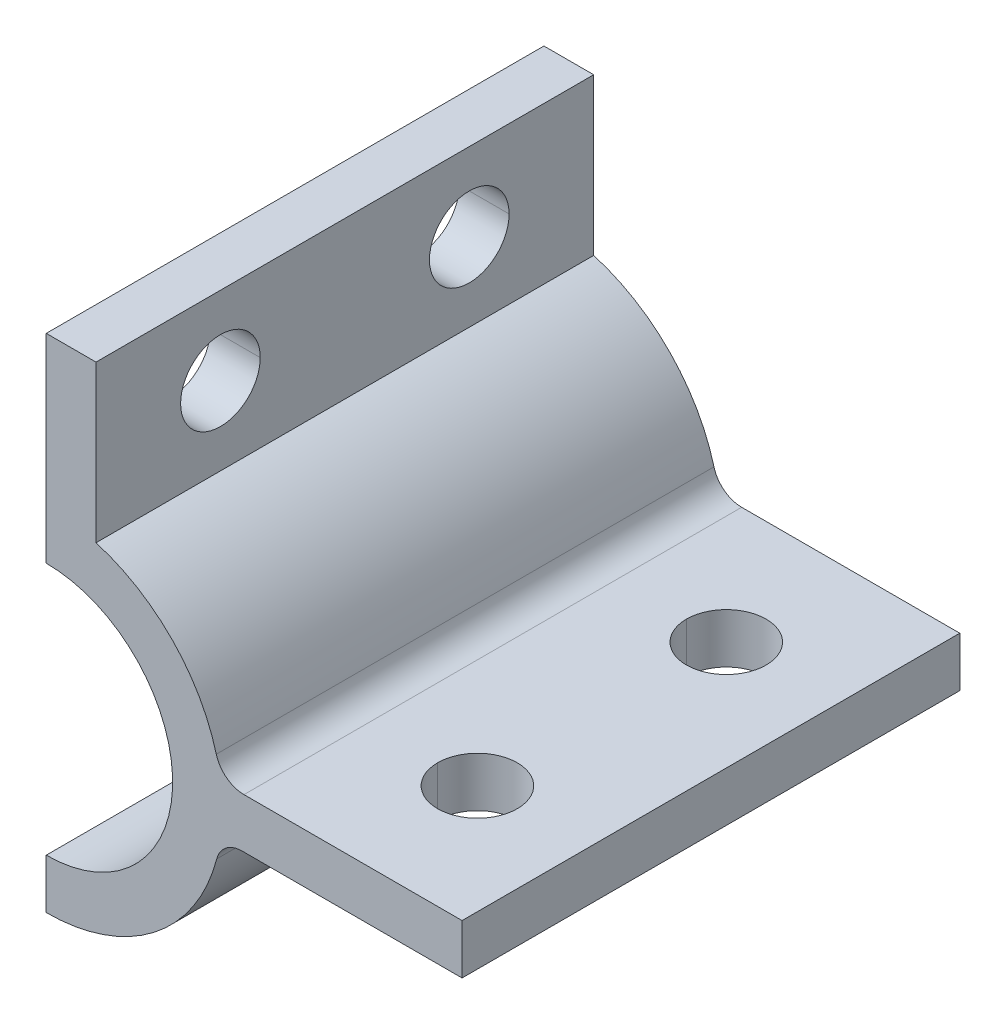
ISO-10303-21;
HEADER;
FILE_DESCRIPTION(('STEP AP214'),'2;1');
FILE_NAME('part.step','',(''),(''),'','','');
FILE_SCHEMA(('AUTOMOTIVE_DESIGN { 1 0 10303 214 1 1 1 1 }'));
ENDSEC;
DATA;
#1=APPLICATION_CONTEXT('core data for automotive mechanical design processes');
#2=APPLICATION_PROTOCOL_DEFINITION('international standard','automotive_design',2000,#1);
#3=PRODUCT_CONTEXT('',#1,'mechanical');
#4=PRODUCT('Part','Part','',(#3));
#5=PRODUCT_RELATED_PRODUCT_CATEGORY('part','',(#4));
#6=PRODUCT_DEFINITION_FORMATION('','',#4);
#7=PRODUCT_DEFINITION_CONTEXT('part definition',#1,'design');
#8=PRODUCT_DEFINITION('design','',#6,#7);
#9=PRODUCT_DEFINITION_SHAPE('','',#8);
#10=(LENGTH_UNIT() NAMED_UNIT(*) SI_UNIT(.MILLI.,.METRE.));
#11=(NAMED_UNIT(*) PLANE_ANGLE_UNIT() SI_UNIT($,.RADIAN.));
#12=(NAMED_UNIT(*) SI_UNIT($,.STERADIAN.) SOLID_ANGLE_UNIT());
#13=UNCERTAINTY_MEASURE_WITH_UNIT(LENGTH_MEASURE(1.E-05),#10,'distance_accuracy_value','');
#14=(GEOMETRIC_REPRESENTATION_CONTEXT(3) GLOBAL_UNCERTAINTY_ASSIGNED_CONTEXT((#13)) GLOBAL_UNIT_ASSIGNED_CONTEXT((#10,
#11,#12)) REPRESENTATION_CONTEXT('',''));
#15=CARTESIAN_POINT('',(0.,0.,0.));
#16=DIRECTION('',(0.,0.,1.));
#17=DIRECTION('',(1.,0.,0.));
#18=AXIS2_PLACEMENT_3D('',#15,#16,#17);
#19=CARTESIAN_POINT('',(5.,24.8395524028066,12.5));
#20=DIRECTION('',(1.,0.,0.));
#21=DIRECTION('',(0.,0.,-1.));
#22=AXIS2_PLACEMENT_3D('',#19,#20,#21);
#23=CYLINDRICAL_SURFACE('',#22,4.);
#24=DIRECTION('',(-1.,0.,0.));
#25=VECTOR('',#24,1.);
#26=CARTESIAN_POINT('',(5.,24.8395524028066,8.5));
#27=LINE('',#26,#25);
#28=CARTESIAN_POINT('',(5.,24.8395524028066,8.5));
#29=VERTEX_POINT('',#28);
#30=CARTESIAN_POINT('',(0.,24.8395524028066,8.5));
#31=VERTEX_POINT('',#30);
#32=EDGE_CURVE('E24',#29,#31,#27,.T.);
#33=ORIENTED_EDGE('',*,*,#32,.T.);
#34=CARTESIAN_POINT('',(0.,24.8395524028066,12.5));
#35=DIRECTION('',(1.,0.,0.));
#36=DIRECTION('',(0.,0.,1.));
#37=AXIS2_PLACEMENT_3D('',#34,#35,#36);
#38=CIRCLE('',#37,4.);
#39=CARTESIAN_POINT('',(0.,24.8395524028066,16.5));
#40=VERTEX_POINT('',#39);
#41=EDGE_CURVE('E31',#40,#31,#38,.T.);
#42=ORIENTED_EDGE('',*,*,#41,.F.);
#43=DIRECTION('',(-1.,0.,0.));
#44=VECTOR('',#43,1.);
#45=CARTESIAN_POINT('',(5.,24.8395524028066,16.5));
#46=LINE('',#45,#44);
#47=CARTESIAN_POINT('',(5.,24.8395524028066,16.5));
#48=VERTEX_POINT('',#47);
#49=EDGE_CURVE('E11',#48,#40,#46,.T.);
#50=ORIENTED_EDGE('',*,*,#49,.F.);
#51=CARTESIAN_POINT('',(5.,24.8395524028066,12.5));
#52=DIRECTION('',(1.,0.,0.));
#53=DIRECTION('',(0.,0.,1.));
#54=AXIS2_PLACEMENT_3D('',#51,#52,#53);
#55=CIRCLE('',#54,4.);
#56=EDGE_CURVE('E231',#48,#29,#55,.T.);
#57=ORIENTED_EDGE('',*,*,#56,.T.);
#58=EDGE_LOOP('',(#33,#42,#50,#57));
#59=FACE_BOUND('',#58,.T.);
#60=ADVANCED_FACE('F17',(#59),#23,.F.);
#61=CARTESIAN_POINT('',(5.,24.8395524028066,12.5));
#62=DIRECTION('',(1.,0.,0.));
#63=DIRECTION('',(0.,0.,-1.));
#64=AXIS2_PLACEMENT_3D('',#61,#62,#63);
#65=CYLINDRICAL_SURFACE('',#64,4.);
#66=ORIENTED_EDGE('',*,*,#49,.T.);
#67=CARTESIAN_POINT('',(0.,24.8395524028066,12.5));
#68=DIRECTION('',(1.,0.,0.));
#69=DIRECTION('',(0.,0.,-1.));
#70=AXIS2_PLACEMENT_3D('',#67,#68,#69);
#71=CIRCLE('',#70,4.);
#72=EDGE_CURVE('E211',#31,#40,#71,.T.);
#73=ORIENTED_EDGE('',*,*,#72,.F.);
#74=ORIENTED_EDGE('',*,*,#32,.F.);
#75=CARTESIAN_POINT('',(5.,24.8395524028066,12.5));
#76=DIRECTION('',(1.,0.,0.));
#77=DIRECTION('',(0.,0.,-1.));
#78=AXIS2_PLACEMENT_3D('',#75,#76,#77);
#79=CIRCLE('',#78,4.);
#80=EDGE_CURVE('E228',#29,#48,#79,.T.);
#81=ORIENTED_EDGE('',*,*,#80,.T.);
#82=EDGE_LOOP('',(#66,#73,#74,#81));
#83=FACE_BOUND('',#82,.T.);
#84=ADVANCED_FACE('F374',(#83),#65,.F.);
#85=CARTESIAN_POINT('',(5.,24.8395524028066,37.5));
#86=DIRECTION('',(1.,0.,0.));
#87=DIRECTION('',(0.,0.,-1.));
#88=AXIS2_PLACEMENT_3D('',#85,#86,#87);
#89=CYLINDRICAL_SURFACE('',#88,4.);
#90=DIRECTION('',(-1.,0.,0.));
#91=VECTOR('',#90,1.);
#92=CARTESIAN_POINT('',(5.,24.8395524028066,33.5));
#93=LINE('',#92,#91);
#94=CARTESIAN_POINT('',(5.,24.8395524028066,33.5));
#95=VERTEX_POINT('',#94);
#96=CARTESIAN_POINT('',(0.,24.8395524028066,33.5));
#97=VERTEX_POINT('',#96);
#98=EDGE_CURVE('E298',#95,#97,#93,.T.);
#99=ORIENTED_EDGE('',*,*,#98,.T.);
#100=CARTESIAN_POINT('',(0.,24.8395524028066,37.5));
#101=DIRECTION('',(1.,0.,0.));
#102=DIRECTION('',(0.,0.,1.));
#103=AXIS2_PLACEMENT_3D('',#100,#101,#102);
#104=CIRCLE('',#103,4.);
#105=CARTESIAN_POINT('',(0.,24.8395524028066,41.5));
#106=VERTEX_POINT('',#105);
#107=EDGE_CURVE('E208',#106,#97,#104,.T.);
#108=ORIENTED_EDGE('',*,*,#107,.F.);
#109=DIRECTION('',(-1.,0.,0.));
#110=VECTOR('',#109,1.);
#111=CARTESIAN_POINT('',(5.,24.8395524028066,41.5));
#112=LINE('',#111,#110);
#113=CARTESIAN_POINT('',(5.,24.8395524028066,41.5));
#114=VERTEX_POINT('',#113);
#115=EDGE_CURVE('E302',#114,#106,#112,.T.);
#116=ORIENTED_EDGE('',*,*,#115,.F.);
#117=CARTESIAN_POINT('',(5.,24.8395524028066,37.5));
#118=DIRECTION('',(1.,0.,0.));
#119=DIRECTION('',(0.,0.,1.));
#120=AXIS2_PLACEMENT_3D('',#117,#118,#119);
#121=CIRCLE('',#120,4.);
#122=EDGE_CURVE('E226',#114,#95,#121,.T.);
#123=ORIENTED_EDGE('',*,*,#122,.T.);
#124=EDGE_LOOP('',(#99,#108,#116,#123));
#125=FACE_BOUND('',#124,.T.);
#126=ADVANCED_FACE('F314',(#125),#89,.F.);
#127=CARTESIAN_POINT('',(5.,24.8395524028066,37.5));
#128=DIRECTION('',(1.,0.,0.));
#129=DIRECTION('',(0.,0.,-1.));
#130=AXIS2_PLACEMENT_3D('',#127,#128,#129);
#131=CYLINDRICAL_SURFACE('',#130,4.);
#132=ORIENTED_EDGE('',*,*,#115,.T.);
#133=CARTESIAN_POINT('',(0.,24.8395524028066,37.5));
#134=DIRECTION('',(1.,0.,0.));
#135=DIRECTION('',(0.,0.,-1.));
#136=AXIS2_PLACEMENT_3D('',#133,#134,#135);
#137=CIRCLE('',#136,4.);
#138=EDGE_CURVE('E205',#97,#106,#137,.T.);
#139=ORIENTED_EDGE('',*,*,#138,.F.);
#140=ORIENTED_EDGE('',*,*,#98,.F.);
#141=CARTESIAN_POINT('',(5.,24.8395524028066,37.5));
#142=DIRECTION('',(1.,0.,0.));
#143=DIRECTION('',(0.,0.,-1.));
#144=AXIS2_PLACEMENT_3D('',#141,#142,#143);
#145=CIRCLE('',#144,4.);
#146=EDGE_CURVE('E223',#95,#114,#145,.T.);
#147=ORIENTED_EDGE('',*,*,#146,.T.);
#148=EDGE_LOOP('',(#132,#139,#140,#147));
#149=FACE_BOUND('',#148,.T.);
#150=ADVANCED_FACE('F306',(#149),#131,.F.);
#151=CARTESIAN_POINT('',(30.8205471747191,2.49921777605013,37.5));
#152=DIRECTION('',(0.,1.,0.));
#153=DIRECTION('',(1.,0.,0.));
#154=AXIS2_PLACEMENT_3D('',#151,#152,#153);
#155=CYLINDRICAL_SURFACE('',#154,4.);
#156=DIRECTION('',(0.,-1.,0.));
#157=VECTOR('',#156,1.);
#158=CARTESIAN_POINT('',(26.8205471747191,2.49921777605013,37.5));
#159=LINE('',#158,#157);
#160=CARTESIAN_POINT('',(26.8205471747191,2.49921777605013,37.5));
#161=VERTEX_POINT('',#160);
#162=CARTESIAN_POINT('',(26.8205471747191,-2.5,37.5));
#163=VERTEX_POINT('',#162);
#164=EDGE_CURVE('E293',#161,#163,#159,.T.);
#165=ORIENTED_EDGE('',*,*,#164,.F.);
#166=CARTESIAN_POINT('',(30.8205471747191,2.49921777605013,37.5));
#167=DIRECTION('',(0.,1.,0.));
#168=DIRECTION('',(-1.,0.,0.));
#169=AXIS2_PLACEMENT_3D('',#166,#167,#168);
#170=CIRCLE('',#169,4.);
#171=CARTESIAN_POINT('',(34.8205471747191,2.49921777605013,37.5));
#172=VERTEX_POINT('',#171);
#173=EDGE_CURVE('E253',#161,#172,#170,.T.);
#174=ORIENTED_EDGE('',*,*,#173,.T.);
#175=DIRECTION('',(0.,-1.,0.));
#176=VECTOR('',#175,1.);
#177=CARTESIAN_POINT('',(34.8205471747191,2.49921777605013,37.5));
#178=LINE('',#177,#176);
#179=CARTESIAN_POINT('',(34.8205471747191,-2.5,37.5));
#180=VERTEX_POINT('',#179);
#181=EDGE_CURVE('E296',#172,#180,#178,.T.);
#182=ORIENTED_EDGE('',*,*,#181,.T.);
#183=CARTESIAN_POINT('',(30.8205471747191,-2.5,37.5));
#184=DIRECTION('',(0.,-1.,0.));
#185=DIRECTION('',(1.,0.,0.));
#186=AXIS2_PLACEMENT_3D('',#183,#184,#185);
#187=CIRCLE('',#186,4.);
#188=EDGE_CURVE('E275',#180,#163,#187,.T.);
#189=ORIENTED_EDGE('',*,*,#188,.T.);
#190=EDGE_LOOP('',(#165,#174,#182,#189));
#191=FACE_BOUND('',#190,.T.);
#192=ADVANCED_FACE('F386',(#191),#155,.F.);
#193=CARTESIAN_POINT('',(30.8205471747191,2.49921777605013,37.5));
#194=DIRECTION('',(0.,1.,0.));
#195=DIRECTION('',(1.,0.,0.));
#196=AXIS2_PLACEMENT_3D('',#193,#194,#195);
#197=CYLINDRICAL_SURFACE('',#196,4.);
#198=ORIENTED_EDGE('',*,*,#181,.F.);
#199=CARTESIAN_POINT('',(30.8205471747191,2.49921777605013,37.5));
#200=DIRECTION('',(0.,1.,0.));
#201=DIRECTION('',(1.,0.,0.));
#202=AXIS2_PLACEMENT_3D('',#199,#200,#201);
#203=CIRCLE('',#202,4.);
#204=EDGE_CURVE('E255',#172,#161,#203,.T.);
#205=ORIENTED_EDGE('',*,*,#204,.T.);
#206=ORIENTED_EDGE('',*,*,#164,.T.);
#207=CARTESIAN_POINT('',(30.8205471747191,-2.5,37.5));
#208=DIRECTION('',(0.,-1.,0.));
#209=DIRECTION('',(-1.,0.,0.));
#210=AXIS2_PLACEMENT_3D('',#207,#208,#209);
#211=CIRCLE('',#210,4.);
#212=EDGE_CURVE('E272',#163,#180,#211,.T.);
#213=ORIENTED_EDGE('',*,*,#212,.T.);
#214=EDGE_LOOP('',(#198,#205,#206,#213));
#215=FACE_BOUND('',#214,.T.);
#216=ADVANCED_FACE('F389',(#215),#197,.F.);
#217=CARTESIAN_POINT('',(30.8205471747191,2.49921777605013,12.5));
#218=DIRECTION('',(0.,1.,0.));
#219=DIRECTION('',(1.,0.,0.));
#220=AXIS2_PLACEMENT_3D('',#217,#218,#219);
#221=CYLINDRICAL_SURFACE('',#220,4.);
#222=DIRECTION('',(0.,-1.,0.));
#223=VECTOR('',#222,1.);
#224=CARTESIAN_POINT('',(26.8205471747191,2.49921777605013,12.5));
#225=LINE('',#224,#223);
#226=CARTESIAN_POINT('',(26.8205471747191,2.49921777605013,12.5));
#227=VERTEX_POINT('',#226);
#228=CARTESIAN_POINT('',(26.8205471747191,-2.5,12.5));
#229=VERTEX_POINT('',#228);
#230=EDGE_CURVE('E289',#227,#229,#225,.T.);
#231=ORIENTED_EDGE('',*,*,#230,.F.);
#232=CARTESIAN_POINT('',(30.8205471747191,2.49921777605013,12.5));
#233=DIRECTION('',(0.,1.,0.));
#234=DIRECTION('',(-1.,0.,0.));
#235=AXIS2_PLACEMENT_3D('',#232,#233,#234);
#236=CIRCLE('',#235,4.);
#237=CARTESIAN_POINT('',(34.8205471747191,2.49921777605013,12.5));
#238=VERTEX_POINT('',#237);
#239=EDGE_CURVE('E248',#227,#238,#236,.T.);
#240=ORIENTED_EDGE('',*,*,#239,.T.);
#241=DIRECTION('',(0.,-1.,0.));
#242=VECTOR('',#241,1.);
#243=CARTESIAN_POINT('',(34.8205471747191,2.49921777605013,12.5));
#244=LINE('',#243,#242);
#245=CARTESIAN_POINT('',(34.8205471747191,-2.5,12.5));
#246=VERTEX_POINT('',#245);
#247=EDGE_CURVE('E291',#238,#246,#244,.T.);
#248=ORIENTED_EDGE('',*,*,#247,.T.);
#249=CARTESIAN_POINT('',(30.8205471747191,-2.5,12.5));
#250=DIRECTION('',(0.,-1.,0.));
#251=DIRECTION('',(1.,0.,0.));
#252=AXIS2_PLACEMENT_3D('',#249,#250,#251);
#253=CIRCLE('',#252,4.);
#254=EDGE_CURVE('E270',#246,#229,#253,.T.);
#255=ORIENTED_EDGE('',*,*,#254,.T.);
#256=EDGE_LOOP('',(#231,#240,#248,#255));
#257=FACE_BOUND('',#256,.T.);
#258=ADVANCED_FACE('F393',(#257),#221,.F.);
#259=CARTESIAN_POINT('',(30.8205471747191,2.49921777605013,12.5));
#260=DIRECTION('',(0.,1.,0.));
#261=DIRECTION('',(1.,0.,0.));
#262=AXIS2_PLACEMENT_3D('',#259,#260,#261);
#263=CYLINDRICAL_SURFACE('',#262,4.);
#264=ORIENTED_EDGE('',*,*,#247,.F.);
#265=CARTESIAN_POINT('',(30.8205471747191,2.49921777605013,12.5));
#266=DIRECTION('',(0.,1.,0.));
#267=DIRECTION('',(1.,0.,0.));
#268=AXIS2_PLACEMENT_3D('',#265,#266,#267);
#269=CIRCLE('',#268,4.);
#270=EDGE_CURVE('E250',#238,#227,#269,.T.);
#271=ORIENTED_EDGE('',*,*,#270,.T.);
#272=ORIENTED_EDGE('',*,*,#230,.T.);
#273=CARTESIAN_POINT('',(30.8205471747191,-2.5,12.5));
#274=DIRECTION('',(0.,-1.,0.));
#275=DIRECTION('',(-1.,0.,0.));
#276=AXIS2_PLACEMENT_3D('',#273,#274,#275);
#277=CIRCLE('',#276,4.);
#278=EDGE_CURVE('E267',#229,#246,#277,.T.);
#279=ORIENTED_EDGE('',*,*,#278,.T.);
#280=EDGE_LOOP('',(#264,#271,#272,#279));
#281=FACE_BOUND('',#280,.T.);
#282=ADVANCED_FACE('F397',(#281),#263,.F.);
#283=CARTESIAN_POINT('',(19.6641494775138,-5.1196965353291,0.));
#284=DIRECTION('',(0.,0.,1.));
#285=DIRECTION('',(1.,0.,0.));
#286=AXIS2_PLACEMENT_3D('',#283,#284,#285);
#287=CYLINDRICAL_SURFACE('',#286,2.6196965353291);
#288=DIRECTION('',(0.,0.,1.));
#289=VECTOR('',#288,1.);
#290=CARTESIAN_POINT('',(19.6641494775138,-2.5,0.));
#291=LINE('',#290,#289);
#292=CARTESIAN_POINT('',(19.6641494775138,-2.5,0.));
#293=VERTEX_POINT('',#292);
#294=CARTESIAN_POINT('',(19.6641494775138,-2.5,50.));
#295=VERTEX_POINT('',#294);
#296=EDGE_CURVE('E264',#293,#295,#291,.T.);
#297=ORIENTED_EDGE('',*,*,#296,.T.);
#298=CARTESIAN_POINT('',(19.6641494775138,-5.1196965353291,50.));
#299=DIRECTION('',(0.,0.,-1.));
#300=DIRECTION('',(-0.967738344090153,0.251957332454623,0.));
#301=AXIS2_PLACEMENT_3D('',#298,#299,#300);
#302=CIRCLE('',#301,2.6196965353291);
#303=CARTESIAN_POINT('',(17.1289686903957,-4.45964478444695,50.));
#304=VERTEX_POINT('',#303);
#305=EDGE_CURVE('E277',#304,#295,#302,.T.);
#306=ORIENTED_EDGE('',*,*,#305,.F.);
#307=DIRECTION('',(0.,0.,1.));
#308=VECTOR('',#307,1.);
#309=CARTESIAN_POINT('',(17.1289686903957,-4.45964478444694,0.));
#310=LINE('',#309,#308);
#311=CARTESIAN_POINT('',(17.1289686903957,-4.45964478444695,0.));
#312=VERTEX_POINT('',#311);
#313=EDGE_CURVE('E196',#312,#304,#310,.T.);
#314=ORIENTED_EDGE('',*,*,#313,.F.);
#315=CARTESIAN_POINT('',(19.6641494775138,-5.1196965353291,0.));
#316=DIRECTION('',(0.,0.,-1.));
#317=DIRECTION('',(-0.967738344090153,0.251957332454623,0.));
#318=AXIS2_PLACEMENT_3D('',#315,#316,#317);
#319=CIRCLE('',#318,2.6196965353291);
#320=EDGE_CURVE('E175',#312,#293,#319,.T.);
#321=ORIENTED_EDGE('',*,*,#320,.T.);
#322=EDGE_LOOP('',(#297,#306,#314,#321));
#323=FACE_BOUND('',#322,.T.);
#324=ADVANCED_FACE('F347',(#323),#287,.F.);
#325=CARTESIAN_POINT('',(0.,0.,50.));
#326=DIRECTION('',(0.,0.,1.));
#327=DIRECTION('',(1.,0.,0.));
#328=AXIS2_PLACEMENT_3D('',#325,#326,#327);
#329=PLANE('',#328);
#330=ORIENTED_EDGE('',*,*,#305,.T.);
#331=DIRECTION('',(1.,0.,0.));
#332=VECTOR('',#331,1.);
#333=CARTESIAN_POINT('',(19.6641494775138,-2.5,50.));
#334=LINE('',#333,#332);
#335=CARTESIAN_POINT('',(41.7762662434583,-2.5,50.));
#336=VERTEX_POINT('',#335);
#337=EDGE_CURVE('E262',#295,#336,#334,.T.);
#338=ORIENTED_EDGE('',*,*,#337,.T.);
#339=DIRECTION('',(0.,1.,0.));
#340=VECTOR('',#339,1.);
#341=CARTESIAN_POINT('',(41.7762662434583,-2.5,50.));
#342=LINE('',#341,#340);
#343=CARTESIAN_POINT('',(41.7762662434583,2.49921777605013,50.));
#344=VERTEX_POINT('',#343);
#345=EDGE_CURVE('E261',#336,#344,#342,.T.);
#346=ORIENTED_EDGE('',*,*,#345,.T.);
#347=DIRECTION('',(-1.,0.,0.));
#348=VECTOR('',#347,1.);
#349=CARTESIAN_POINT('',(41.7762662434583,2.49921777605013,50.));
#350=LINE('',#349,#348);
#351=CARTESIAN_POINT('',(19.8648281059799,2.49921777605013,50.));
#352=VERTEX_POINT('',#351);
#353=EDGE_CURVE('E246',#344,#352,#350,.T.);
#354=ORIENTED_EDGE('',*,*,#353,.T.);
#355=CARTESIAN_POINT('',(19.8648281059799,5.3795789272771,50.));
#356=DIRECTION('',(0.,0.,-1.));
#357=DIRECTION('',(0.,-1.,0.));
#358=AXIS2_PLACEMENT_3D('',#355,#356,#357);
#359=CIRCLE('',#358,2.88036115122697);
#360=CARTESIAN_POINT('',(17.0846106582965,4.62667036370877,50.));
#361=VERTEX_POINT('',#360);
#362=EDGE_CURVE('E240',#352,#361,#359,.T.);
#363=ORIENTED_EDGE('',*,*,#362,.T.);
#364=CARTESIAN_POINT('',(0.,0.,50.));
#365=DIRECTION('',(0.,0.,1.));
#366=DIRECTION('',(0.965232240581724,0.261393805859255,0.));
#367=AXIS2_PLACEMENT_3D('',#364,#365,#366);
#368=CIRCLE('',#367,17.7);
#369=CARTESIAN_POINT('',(5.,16.9791048056133,50.));
#370=VERTEX_POINT('',#369);
#371=EDGE_CURVE('E236',#361,#370,#368,.T.);
#372=ORIENTED_EDGE('',*,*,#371,.T.);
#373=DIRECTION('',(0.,1.,0.));
#374=VECTOR('',#373,1.);
#375=CARTESIAN_POINT('',(5.,16.9791048056133,50.));
#376=LINE('',#375,#374);
#377=CARTESIAN_POINT('',(5.,32.7,50.));
#378=VERTEX_POINT('',#377);
#379=EDGE_CURVE('E222',#370,#378,#376,.T.);
#380=ORIENTED_EDGE('',*,*,#379,.T.);
#381=DIRECTION('',(-1.,0.,0.));
#382=VECTOR('',#381,1.);
#383=CARTESIAN_POINT('',(5.,32.7,50.));
#384=LINE('',#383,#382);
#385=CARTESIAN_POINT('',(0.,32.7,50.));
#386=VERTEX_POINT('',#385);
#387=EDGE_CURVE('E218',#378,#386,#384,.T.);
#388=ORIENTED_EDGE('',*,*,#387,.T.);
#389=DIRECTION('',(0.,-1.,0.));
#390=VECTOR('',#389,1.);
#391=CARTESIAN_POINT('',(0.,32.7,50.));
#392=LINE('',#391,#390);
#393=CARTESIAN_POINT('',(0.,12.7,50.));
#394=VERTEX_POINT('',#393);
#395=EDGE_CURVE('E204',#386,#394,#392,.T.);
#396=ORIENTED_EDGE('',*,*,#395,.T.);
#397=CARTESIAN_POINT('',(0.,0.,50.));
#398=DIRECTION('',(0.,0.,-1.));
#399=DIRECTION('',(0.,1.,0.));
#400=AXIS2_PLACEMENT_3D('',#397,#398,#399);
#401=CIRCLE('',#400,12.7);
#402=CARTESIAN_POINT('',(0.,-12.7,50.));
#403=VERTEX_POINT('',#402);
#404=EDGE_CURVE('E200',#394,#403,#401,.T.);
#405=ORIENTED_EDGE('',*,*,#404,.T.);
#406=DIRECTION('',(0.,-1.,0.));
#407=VECTOR('',#406,1.);
#408=CARTESIAN_POINT('',(0.,-12.7,50.));
#409=LINE('',#408,#407);
#410=CARTESIAN_POINT('',(0.,-17.7,50.));
#411=VERTEX_POINT('',#410);
#412=EDGE_CURVE('E195',#403,#411,#409,.T.);
#413=ORIENTED_EDGE('',*,*,#412,.T.);
#414=CARTESIAN_POINT('',(0.,0.,50.));
#415=DIRECTION('',(0.,0.,1.));
#416=DIRECTION('',(0.,-1.,0.));
#417=AXIS2_PLACEMENT_3D('',#414,#415,#416);
#418=CIRCLE('',#417,17.7);
#419=EDGE_CURVE('E171',#411,#304,#418,.T.);
#420=ORIENTED_EDGE('',*,*,#419,.T.);
#421=EDGE_LOOP('',(#330,#338,#346,#354,#363,#372,#380,#388,#396,#405,#413,#420));
#422=FACE_BOUND('',#421,.T.);
#423=ADVANCED_FACE('F333',(#422),#329,.T.);
#424=CARTESIAN_POINT('',(19.6641494775138,-2.5,0.));
#425=DIRECTION('',(0.,-1.,0.));
#426=DIRECTION('',(1.,0.,0.));
#427=AXIS2_PLACEMENT_3D('',#424,#425,#426);
#428=PLANE('',#427);
#429=ORIENTED_EDGE('',*,*,#188,.F.);
#430=ORIENTED_EDGE('',*,*,#212,.F.);
#431=EDGE_LOOP('',(#429,#430));
#432=FACE_BOUND('',#431,.T.);
#433=ORIENTED_EDGE('',*,*,#254,.F.);
#434=ORIENTED_EDGE('',*,*,#278,.F.);
#435=EDGE_LOOP('',(#433,#434));
#436=FACE_BOUND('',#435,.T.);
#437=ORIENTED_EDGE('',*,*,#296,.F.);
#438=DIRECTION('',(-1.,0.,0.));
#439=VECTOR('',#438,1.);
#440=CARTESIAN_POINT('',(41.7762662434583,-2.5,0.));
#441=LINE('',#440,#439);
#442=CARTESIAN_POINT('',(41.7762662434583,-2.5,0.));
#443=VERTEX_POINT('',#442);
#444=EDGE_CURVE('E177',#443,#293,#441,.T.);
#445=ORIENTED_EDGE('',*,*,#444,.F.);
#446=DIRECTION('',(0.,0.,1.));
#447=VECTOR('',#446,1.);
#448=CARTESIAN_POINT('',(41.7762662434583,-2.5,0.));
#449=LINE('',#448,#447);
#450=EDGE_CURVE('E258',#443,#336,#449,.T.);
#451=ORIENTED_EDGE('',*,*,#450,.T.);
#452=ORIENTED_EDGE('',*,*,#337,.F.);
#453=EDGE_LOOP('',(#437,#445,#451,#452));
#454=FACE_BOUND('',#453,.T.);
#455=ADVANCED_FACE('F350',(#432,#436,#454),#428,.T.);
#456=CARTESIAN_POINT('',(41.7762662434583,-2.5,0.));
#457=DIRECTION('',(1.,0.,0.));
#458=DIRECTION('',(0.,1.,0.));
#459=AXIS2_PLACEMENT_3D('',#456,#457,#458);
#460=PLANE('',#459);
#461=DIRECTION('',(0.,0.,1.));
#462=VECTOR('',#461,1.);
#463=CARTESIAN_POINT('',(41.7762662434583,2.49921777605013,0.));
#464=LINE('',#463,#462);
#465=CARTESIAN_POINT('',(41.7762662434583,2.49921777605013,0.));
#466=VERTEX_POINT('',#465);
#467=EDGE_CURVE('E243',#466,#344,#464,.T.);
#468=ORIENTED_EDGE('',*,*,#467,.T.);
#469=ORIENTED_EDGE('',*,*,#345,.F.);
#470=ORIENTED_EDGE('',*,*,#450,.F.);
#471=DIRECTION('',(0.,1.,0.));
#472=VECTOR('',#471,1.);
#473=CARTESIAN_POINT('',(41.7762662434583,-2.5,0.));
#474=LINE('',#473,#472);
#475=EDGE_CURVE('E180',#443,#466,#474,.T.);
#476=ORIENTED_EDGE('',*,*,#475,.T.);
#477=EDGE_LOOP('',(#468,#469,#470,#476));
#478=FACE_BOUND('',#477,.T.);
#479=ADVANCED_FACE('F355',(#478),#460,.T.);
#480=CARTESIAN_POINT('',(32.7024452708055,2.49921777605013,0.));
#481=DIRECTION('',(0.,1.,0.));
#482=DIRECTION('',(-1.,0.,0.));
#483=AXIS2_PLACEMENT_3D('',#480,#481,#482);
#484=PLANE('',#483);
#485=ORIENTED_EDGE('',*,*,#204,.F.);
#486=ORIENTED_EDGE('',*,*,#173,.F.);
#487=EDGE_LOOP('',(#485,#486));
#488=FACE_BOUND('',#487,.T.);
#489=ORIENTED_EDGE('',*,*,#270,.F.);
#490=ORIENTED_EDGE('',*,*,#239,.F.);
#491=EDGE_LOOP('',(#489,#490));
#492=FACE_BOUND('',#491,.T.);
#493=DIRECTION('',(0.,0.,1.));
#494=VECTOR('',#493,1.);
#495=CARTESIAN_POINT('',(19.8648281059799,2.49921777605013,0.));
#496=LINE('',#495,#494);
#497=CARTESIAN_POINT('',(19.8648281059799,2.49921777605013,0.));
#498=VERTEX_POINT('',#497);
#499=EDGE_CURVE('E237',#498,#352,#496,.T.);
#500=ORIENTED_EDGE('',*,*,#499,.T.);
#501=ORIENTED_EDGE('',*,*,#353,.F.);
#502=ORIENTED_EDGE('',*,*,#467,.F.);
#503=DIRECTION('',(1.,0.,0.));
#504=VECTOR('',#503,1.);
#505=CARTESIAN_POINT('',(19.8648281059799,2.49921777605013,0.));
#506=LINE('',#505,#504);
#507=EDGE_CURVE('E182',#498,#466,#506,.T.);
#508=ORIENTED_EDGE('',*,*,#507,.F.);
#509=EDGE_LOOP('',(#500,#501,#502,#508));
#510=FACE_BOUND('',#509,.T.);
#511=ADVANCED_FACE('F359',(#488,#492,#510),#484,.T.);
#512=CARTESIAN_POINT('',(19.8648281059799,5.3795789272771,0.));
#513=DIRECTION('',(0.,0.,1.));
#514=DIRECTION('',(1.,0.,0.));
#515=AXIS2_PLACEMENT_3D('',#512,#513,#514);
#516=CYLINDRICAL_SURFACE('',#515,2.88036115122697);
#517=DIRECTION('',(0.,0.,1.));
#518=VECTOR('',#517,1.);
#519=CARTESIAN_POINT('',(17.0846106582965,4.62667036370875,0.));
#520=LINE('',#519,#518);
#521=CARTESIAN_POINT('',(17.0846106582965,4.62667036370877,0.));
#522=VERTEX_POINT('',#521);
#523=EDGE_CURVE('E233',#522,#361,#520,.T.);
#524=ORIENTED_EDGE('',*,*,#523,.T.);
#525=ORIENTED_EDGE('',*,*,#362,.F.);
#526=ORIENTED_EDGE('',*,*,#499,.F.);
#527=CARTESIAN_POINT('',(19.8648281059799,5.3795789272771,0.));
#528=DIRECTION('',(0.,0.,-1.));
#529=DIRECTION('',(0.,-1.,0.));
#530=AXIS2_PLACEMENT_3D('',#527,#528,#529);
#531=CIRCLE('',#530,2.88036115122697);
#532=EDGE_CURVE('E183',#498,#522,#531,.T.);
#533=ORIENTED_EDGE('',*,*,#532,.T.);
#534=EDGE_LOOP('',(#524,#525,#526,#533));
#535=FACE_BOUND('',#534,.T.);
#536=ADVANCED_FACE('F362',(#535),#516,.F.);
#537=CARTESIAN_POINT('',(0.,0.,0.));
#538=DIRECTION('',(0.,0.,1.));
#539=DIRECTION('',(1.,0.,0.));
#540=AXIS2_PLACEMENT_3D('',#537,#538,#539);
#541=CYLINDRICAL_SURFACE('',#540,17.7);
#542=DIRECTION('',(0.,0.,1.));
#543=VECTOR('',#542,1.);
#544=CARTESIAN_POINT('',(5.,16.9791048056133,0.));
#545=LINE('',#544,#543);
#546=CARTESIAN_POINT('',(5.,16.9791048056133,0.));
#547=VERTEX_POINT('',#546);
#548=EDGE_CURVE('E219',#547,#370,#545,.T.);
#549=ORIENTED_EDGE('',*,*,#548,.T.);
#550=ORIENTED_EDGE('',*,*,#371,.F.);
#551=ORIENTED_EDGE('',*,*,#523,.F.);
#552=CARTESIAN_POINT('',(0.,0.,0.));
#553=DIRECTION('',(0.,0.,1.));
#554=DIRECTION('',(0.965232240581724,0.261393805859255,0.));
#555=AXIS2_PLACEMENT_3D('',#552,#553,#554);
#556=CIRCLE('',#555,17.7);
#557=EDGE_CURVE('E185',#522,#547,#556,.T.);
#558=ORIENTED_EDGE('',*,*,#557,.T.);
#559=EDGE_LOOP('',(#549,#550,#551,#558));
#560=FACE_BOUND('',#559,.T.);
#561=ADVANCED_FACE('F320',(#560),#541,.T.);
#562=CARTESIAN_POINT('',(5.,16.9791048056133,0.));
#563=DIRECTION('',(1.,0.,0.));
#564=DIRECTION('',(0.,1.,0.));
#565=AXIS2_PLACEMENT_3D('',#562,#563,#564);
#566=PLANE('',#565);
#567=ORIENTED_EDGE('',*,*,#56,.F.);
#568=ORIENTED_EDGE('',*,*,#80,.F.);
#569=EDGE_LOOP('',(#567,#568));
#570=FACE_BOUND('',#569,.T.);
#571=ORIENTED_EDGE('',*,*,#122,.F.);
#572=ORIENTED_EDGE('',*,*,#146,.F.);
#573=EDGE_LOOP('',(#571,#572));
#574=FACE_BOUND('',#573,.T.);
#575=DIRECTION('',(0.,0.,1.));
#576=VECTOR('',#575,1.);
#577=CARTESIAN_POINT('',(5.,32.7,0.));
#578=LINE('',#577,#576);
#579=CARTESIAN_POINT('',(5.,32.7,0.));
#580=VERTEX_POINT('',#579);
#581=EDGE_CURVE('E215',#580,#378,#578,.T.);
#582=ORIENTED_EDGE('',*,*,#581,.T.);
#583=ORIENTED_EDGE('',*,*,#379,.F.);
#584=ORIENTED_EDGE('',*,*,#548,.F.);
#585=DIRECTION('',(0.,1.,0.));
#586=VECTOR('',#585,1.);
#587=CARTESIAN_POINT('',(5.,16.9791048056133,0.));
#588=LINE('',#587,#586);
#589=EDGE_CURVE('E187',#547,#580,#588,.T.);
#590=ORIENTED_EDGE('',*,*,#589,.T.);
#591=EDGE_LOOP('',(#582,#583,#584,#590));
#592=FACE_BOUND('',#591,.T.);
#593=ADVANCED_FACE('F316',(#570,#574,#592),#566,.T.);
#594=CARTESIAN_POINT('',(5.,32.7,0.));
#595=DIRECTION('',(0.,1.,0.));
#596=DIRECTION('',(-1.,0.,0.));
#597=AXIS2_PLACEMENT_3D('',#594,#595,#596);
#598=PLANE('',#597);
#599=DIRECTION('',(0.,0.,1.));
#600=VECTOR('',#599,1.);
#601=CARTESIAN_POINT('',(0.,32.7,0.));
#602=LINE('',#601,#600);
#603=CARTESIAN_POINT('',(0.,32.7,0.));
#604=VERTEX_POINT('',#603);
#605=EDGE_CURVE('E201',#604,#386,#602,.T.);
#606=ORIENTED_EDGE('',*,*,#605,.T.);
#607=ORIENTED_EDGE('',*,*,#387,.F.);
#608=ORIENTED_EDGE('',*,*,#581,.F.);
#609=DIRECTION('',(-1.,0.,0.));
#610=VECTOR('',#609,1.);
#611=CARTESIAN_POINT('',(5.,32.7,0.));
#612=LINE('',#611,#610);
#613=EDGE_CURVE('E189',#580,#604,#612,.T.);
#614=ORIENTED_EDGE('',*,*,#613,.T.);
#615=EDGE_LOOP('',(#606,#607,#608,#614));
#616=FACE_BOUND('',#615,.T.);
#617=ADVANCED_FACE('F319',(#616),#598,.T.);
#618=CARTESIAN_POINT('',(0.,32.7,0.));
#619=DIRECTION('',(-1.,0.,0.));
#620=DIRECTION('',(0.,-1.,0.));
#621=AXIS2_PLACEMENT_3D('',#618,#619,#620);
#622=PLANE('',#621);
#623=ORIENTED_EDGE('',*,*,#41,.T.);
#624=ORIENTED_EDGE('',*,*,#72,.T.);
#625=EDGE_LOOP('',(#623,#624));
#626=FACE_BOUND('',#625,.T.);
#627=ORIENTED_EDGE('',*,*,#107,.T.);
#628=ORIENTED_EDGE('',*,*,#138,.T.);
#629=EDGE_LOOP('',(#627,#628));
#630=FACE_BOUND('',#629,.T.);
#631=DIRECTION('',(0.,0.,1.));
#632=VECTOR('',#631,1.);
#633=CARTESIAN_POINT('',(0.,12.7,0.));
#634=LINE('',#633,#632);
#635=CARTESIAN_POINT('',(0.,12.7,0.));
#636=VERTEX_POINT('',#635);
#637=EDGE_CURVE('E197',#636,#394,#634,.T.);
#638=ORIENTED_EDGE('',*,*,#637,.T.);
#639=ORIENTED_EDGE('',*,*,#395,.F.);
#640=ORIENTED_EDGE('',*,*,#605,.F.);
#641=DIRECTION('',(0.,-1.,0.));
#642=VECTOR('',#641,1.);
#643=CARTESIAN_POINT('',(0.,32.7,0.));
#644=LINE('',#643,#642);
#645=EDGE_CURVE('E191',#604,#636,#644,.T.);
#646=ORIENTED_EDGE('',*,*,#645,.T.);
#647=EDGE_LOOP('',(#638,#639,#640,#646));
#648=FACE_BOUND('',#647,.T.);
#649=ADVANCED_FACE('F312',(#626,#630,#648),#622,.T.);
#650=CARTESIAN_POINT('',(0.,0.,0.));
#651=DIRECTION('',(0.,0.,1.));
#652=DIRECTION('',(1.,0.,0.));
#653=AXIS2_PLACEMENT_3D('',#650,#651,#652);
#654=CYLINDRICAL_SURFACE('',#653,12.7);
#655=DIRECTION('',(0.,0.,1.));
#656=VECTOR('',#655,1.);
#657=CARTESIAN_POINT('',(0.,-12.7,0.));
#658=LINE('',#657,#656);
#659=CARTESIAN_POINT('',(0.,-12.7,0.));
#660=VERTEX_POINT('',#659);
#661=EDGE_CURVE('E158',#660,#403,#658,.T.);
#662=ORIENTED_EDGE('',*,*,#661,.T.);
#663=ORIENTED_EDGE('',*,*,#404,.F.);
#664=ORIENTED_EDGE('',*,*,#637,.F.);
#665=CARTESIAN_POINT('',(0.,0.,0.));
#666=DIRECTION('',(0.,0.,-1.));
#667=DIRECTION('',(0.,1.,0.));
#668=AXIS2_PLACEMENT_3D('',#665,#666,#667);
#669=CIRCLE('',#668,12.7);
#670=EDGE_CURVE('E162',#636,#660,#669,.T.);
#671=ORIENTED_EDGE('',*,*,#670,.T.);
#672=EDGE_LOOP('',(#662,#663,#664,#671));
#673=FACE_BOUND('',#672,.T.);
#674=ADVANCED_FACE('F344',(#673),#654,.F.);
#675=CARTESIAN_POINT('',(0.,-12.7,0.));
#676=DIRECTION('',(-1.,0.,0.));
#677=DIRECTION('',(0.,-1.,0.));
#678=AXIS2_PLACEMENT_3D('',#675,#676,#677);
#679=PLANE('',#678);
#680=DIRECTION('',(0.,0.,1.));
#681=VECTOR('',#680,1.);
#682=CARTESIAN_POINT('',(0.,-17.7,0.));
#683=LINE('',#682,#681);
#684=CARTESIAN_POINT('',(0.,-17.7,0.));
#685=VERTEX_POINT('',#684);
#686=EDGE_CURVE('E155',#685,#411,#683,.T.);
#687=ORIENTED_EDGE('',*,*,#686,.T.);
#688=ORIENTED_EDGE('',*,*,#412,.F.);
#689=ORIENTED_EDGE('',*,*,#661,.F.);
#690=DIRECTION('',(0.,-1.,0.));
#691=VECTOR('',#690,1.);
#692=CARTESIAN_POINT('',(0.,-12.7,0.));
#693=LINE('',#692,#691);
#694=EDGE_CURVE('E151',#660,#685,#693,.T.);
#695=ORIENTED_EDGE('',*,*,#694,.T.);
#696=EDGE_LOOP('',(#687,#688,#689,#695));
#697=FACE_BOUND('',#696,.T.);
#698=ADVANCED_FACE('F153',(#697),#679,.T.);
#699=CARTESIAN_POINT('',(0.,0.,0.));
#700=DIRECTION('',(0.,0.,1.));
#701=DIRECTION('',(1.,0.,0.));
#702=AXIS2_PLACEMENT_3D('',#699,#700,#701);
#703=CYLINDRICAL_SURFACE('',#702,17.7);
#704=ORIENTED_EDGE('',*,*,#313,.T.);
#705=ORIENTED_EDGE('',*,*,#419,.F.);
#706=ORIENTED_EDGE('',*,*,#686,.F.);
#707=CARTESIAN_POINT('',(0.,0.,0.));
#708=DIRECTION('',(0.,0.,1.));
#709=DIRECTION('',(0.,-1.,0.));
#710=AXIS2_PLACEMENT_3D('',#707,#708,#709);
#711=CIRCLE('',#710,17.7);
#712=EDGE_CURVE('E168',#685,#312,#711,.T.);
#713=ORIENTED_EDGE('',*,*,#712,.T.);
#714=EDGE_LOOP('',(#704,#705,#706,#713));
#715=FACE_BOUND('',#714,.T.);
#716=ADVANCED_FACE('F167',(#715),#703,.T.);
#717=CARTESIAN_POINT('',(0.,0.,0.));
#718=DIRECTION('',(0.,0.,1.));
#719=DIRECTION('',(1.,0.,0.));
#720=AXIS2_PLACEMENT_3D('',#717,#718,#719);
#721=PLANE('',#720);
#722=ORIENTED_EDGE('',*,*,#694,.F.);
#723=ORIENTED_EDGE('',*,*,#670,.F.);
#724=ORIENTED_EDGE('',*,*,#645,.F.);
#725=ORIENTED_EDGE('',*,*,#613,.F.);
#726=ORIENTED_EDGE('',*,*,#589,.F.);
#727=ORIENTED_EDGE('',*,*,#557,.F.);
#728=ORIENTED_EDGE('',*,*,#532,.F.);
#729=ORIENTED_EDGE('',*,*,#507,.T.);
#730=ORIENTED_EDGE('',*,*,#475,.F.);
#731=ORIENTED_EDGE('',*,*,#444,.T.);
#732=ORIENTED_EDGE('',*,*,#320,.F.);
#733=ORIENTED_EDGE('',*,*,#712,.F.);
#734=EDGE_LOOP('',(#722,#723,#724,#725,#726,#727,#728,#729,#730,#731,#732,#733));
#735=FACE_BOUND('',#734,.T.);
#736=ADVANCED_FACE('F173',(#735),#721,.F.);
#737=CLOSED_SHELL('',(#60,#84,#126,#150,#192,#216,#258,#282,#324,#423,#455,#479,#511,#536,#561,
#593,#617,#649,#674,#698,#716,#736));
#738=MANIFOLD_SOLID_BREP('B1',#737);
#739=ADVANCED_BREP_SHAPE_REPRESENTATION('',(#18,#738),#14);
#740=SHAPE_DEFINITION_REPRESENTATION(#9,#739);
ENDSEC;
END-ISO-10303-21;
